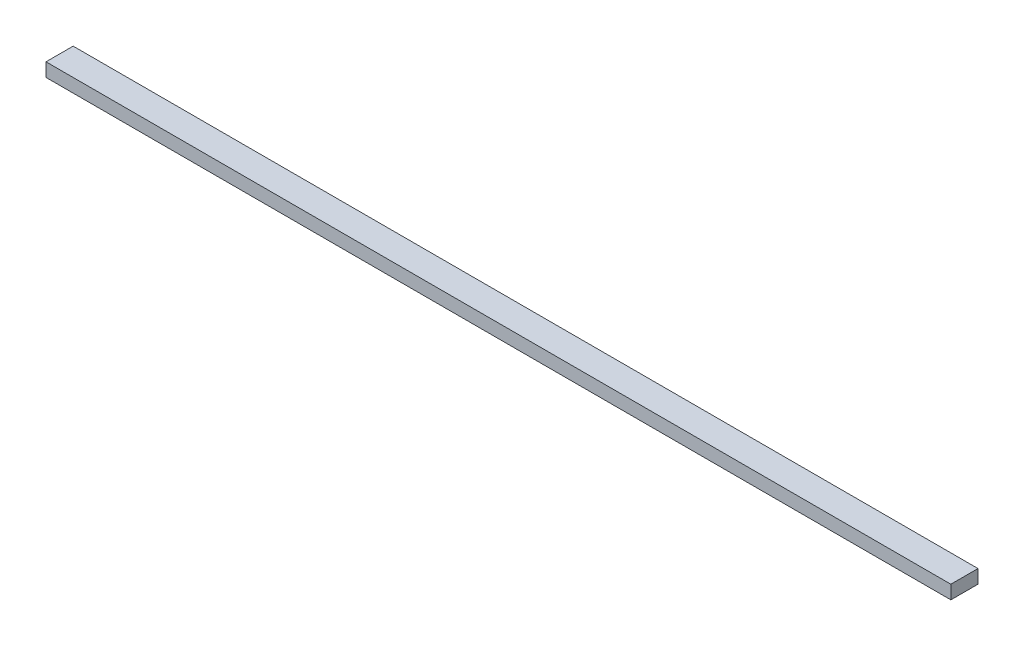
ISO-10303-21;
HEADER;
FILE_DESCRIPTION(('STEP AP214'),'2;1');
FILE_NAME('part.step','',(''),(''),'','','');
FILE_SCHEMA(('AUTOMOTIVE_DESIGN { 1 0 10303 214 1 1 1 1 }'));
ENDSEC;
DATA;
#1=APPLICATION_CONTEXT('core data for automotive mechanical design processes');
#2=APPLICATION_PROTOCOL_DEFINITION('international standard','automotive_design',2000,#1);
#3=PRODUCT_CONTEXT('',#1,'mechanical');
#4=PRODUCT('Part','Part','',(#3));
#5=PRODUCT_RELATED_PRODUCT_CATEGORY('part','',(#4));
#6=PRODUCT_DEFINITION_FORMATION('','',#4);
#7=PRODUCT_DEFINITION_CONTEXT('part definition',#1,'design');
#8=PRODUCT_DEFINITION('design','',#6,#7);
#9=PRODUCT_DEFINITION_SHAPE('','',#8);
#10=(LENGTH_UNIT() NAMED_UNIT(*) SI_UNIT(.MILLI.,.METRE.));
#11=(NAMED_UNIT(*) PLANE_ANGLE_UNIT() SI_UNIT($,.RADIAN.));
#12=(NAMED_UNIT(*) SI_UNIT($,.STERADIAN.) SOLID_ANGLE_UNIT());
#13=UNCERTAINTY_MEASURE_WITH_UNIT(LENGTH_MEASURE(1.E-05),#10,'distance_accuracy_value','');
#14=(GEOMETRIC_REPRESENTATION_CONTEXT(3) GLOBAL_UNCERTAINTY_ASSIGNED_CONTEXT((#13)) GLOBAL_UNIT_ASSIGNED_CONTEXT((#10,
#11,#12)) REPRESENTATION_CONTEXT('',''));
#15=CARTESIAN_POINT('',(0.,0.,0.));
#16=DIRECTION('',(0.,0.,1.));
#17=DIRECTION('',(1.,0.,0.));
#18=AXIS2_PLACEMENT_3D('',#15,#16,#17);
#19=CARTESIAN_POINT('',(100.,3.,3.));
#20=DIRECTION('',(-1.,0.,0.));
#21=DIRECTION('',(0.,0.,1.));
#22=AXIS2_PLACEMENT_3D('',#19,#20,#21);
#23=PLANE('',#22);
#24=DIRECTION('',(0.,0.,-1.));
#25=VECTOR('',#24,1.);
#26=CARTESIAN_POINT('',(100.,0.,3.));
#27=LINE('',#26,#25);
#28=CARTESIAN_POINT('',(100.,0.,3.));
#29=VERTEX_POINT('',#28);
#30=CARTESIAN_POINT('',(100.,0.,-3.));
#31=VERTEX_POINT('',#30);
#32=EDGE_CURVE('E98',#29,#31,#27,.T.);
#33=ORIENTED_EDGE('',*,*,#32,.T.);
#34=DIRECTION('',(0.,-1.,0.));
#35=VECTOR('',#34,1.);
#36=CARTESIAN_POINT('',(100.,3.,-3.));
#37=LINE('',#36,#35);
#38=CARTESIAN_POINT('',(100.,3.,-3.));
#39=VERTEX_POINT('',#38);
#40=EDGE_CURVE('E11',#39,#31,#37,.T.);
#41=ORIENTED_EDGE('',*,*,#40,.F.);
#42=DIRECTION('',(0.,0.,-1.));
#43=VECTOR('',#42,1.);
#44=CARTESIAN_POINT('',(100.,3.,3.));
#45=LINE('',#44,#43);
#46=CARTESIAN_POINT('',(100.,3.,3.));
#47=VERTEX_POINT('',#46);
#48=EDGE_CURVE('E86',#47,#39,#45,.T.);
#49=ORIENTED_EDGE('',*,*,#48,.F.);
#50=DIRECTION('',(0.,-1.,0.));
#51=VECTOR('',#50,1.);
#52=CARTESIAN_POINT('',(100.,3.,3.));
#53=LINE('',#52,#51);
#54=EDGE_CURVE('E94',#47,#29,#53,.T.);
#55=ORIENTED_EDGE('',*,*,#54,.T.);
#56=EDGE_LOOP('',(#33,#41,#49,#55));
#57=FACE_BOUND('',#56,.T.);
#58=ADVANCED_FACE('F35',(#57),#23,.F.);
#59=CARTESIAN_POINT('',(-100.,3.,-3.));
#60=DIRECTION('',(0.,0.,1.));
#61=DIRECTION('',(1.,0.,0.));
#62=AXIS2_PLACEMENT_3D('',#59,#60,#61);
#63=PLANE('',#62);
#64=DIRECTION('',(-1.,0.,0.));
#65=VECTOR('',#64,1.);
#66=CARTESIAN_POINT('',(-100.,0.,-3.));
#67=LINE('',#66,#65);
#68=CARTESIAN_POINT('',(-100.,0.,-3.));
#69=VERTEX_POINT('',#68);
#70=EDGE_CURVE('E90',#31,#69,#67,.T.);
#71=ORIENTED_EDGE('',*,*,#70,.T.);
#72=DIRECTION('',(0.,-1.,0.));
#73=VECTOR('',#72,1.);
#74=CARTESIAN_POINT('',(-100.,3.,-3.));
#75=LINE('',#74,#73);
#76=CARTESIAN_POINT('',(-100.,3.,-3.));
#77=VERTEX_POINT('',#76);
#78=EDGE_CURVE('E43',#77,#69,#75,.T.);
#79=ORIENTED_EDGE('',*,*,#78,.F.);
#80=DIRECTION('',(-1.,0.,0.));
#81=VECTOR('',#80,1.);
#82=CARTESIAN_POINT('',(-100.,3.,-3.));
#83=LINE('',#82,#81);
#84=EDGE_CURVE('E81',#39,#77,#83,.T.);
#85=ORIENTED_EDGE('',*,*,#84,.F.);
#86=ORIENTED_EDGE('',*,*,#40,.T.);
#87=EDGE_LOOP('',(#71,#79,#85,#86));
#88=FACE_BOUND('',#87,.T.);
#89=ADVANCED_FACE('F89',(#88),#63,.F.);
#90=CARTESIAN_POINT('',(-100.,3.,3.));
#91=DIRECTION('',(1.,0.,0.));
#92=DIRECTION('',(0.,0.,-1.));
#93=AXIS2_PLACEMENT_3D('',#90,#91,#92);
#94=PLANE('',#93);
#95=DIRECTION('',(0.,0.,1.));
#96=VECTOR('',#95,1.);
#97=CARTESIAN_POINT('',(-100.,0.,3.));
#98=LINE('',#97,#96);
#99=CARTESIAN_POINT('',(-100.,0.,3.));
#100=VERTEX_POINT('',#99);
#101=EDGE_CURVE('E68',#69,#100,#98,.T.);
#102=ORIENTED_EDGE('',*,*,#101,.T.);
#103=DIRECTION('',(0.,-1.,0.));
#104=VECTOR('',#103,1.);
#105=CARTESIAN_POINT('',(-100.,3.,3.));
#106=LINE('',#105,#104);
#107=CARTESIAN_POINT('',(-100.,3.,3.));
#108=VERTEX_POINT('',#107);
#109=EDGE_CURVE('E91',#108,#100,#106,.T.);
#110=ORIENTED_EDGE('',*,*,#109,.F.);
#111=DIRECTION('',(0.,0.,1.));
#112=VECTOR('',#111,1.);
#113=CARTESIAN_POINT('',(-100.,3.,3.));
#114=LINE('',#113,#112);
#115=EDGE_CURVE('E84',#77,#108,#114,.T.);
#116=ORIENTED_EDGE('',*,*,#115,.F.);
#117=ORIENTED_EDGE('',*,*,#78,.T.);
#118=EDGE_LOOP('',(#102,#110,#116,#117));
#119=FACE_BOUND('',#118,.T.);
#120=ADVANCED_FACE('F92',(#119),#94,.F.);
#121=CARTESIAN_POINT('',(-100.,3.,3.));
#122=DIRECTION('',(0.,0.,-1.));
#123=DIRECTION('',(-1.,0.,0.));
#124=AXIS2_PLACEMENT_3D('',#121,#122,#123);
#125=PLANE('',#124);
#126=DIRECTION('',(1.,0.,0.));
#127=VECTOR('',#126,1.);
#128=CARTESIAN_POINT('',(-100.,0.,3.));
#129=LINE('',#128,#127);
#130=EDGE_CURVE('E74',#100,#29,#129,.T.);
#131=ORIENTED_EDGE('',*,*,#130,.T.);
#132=ORIENTED_EDGE('',*,*,#54,.F.);
#133=DIRECTION('',(1.,0.,0.));
#134=VECTOR('',#133,1.);
#135=CARTESIAN_POINT('',(-100.,3.,3.));
#136=LINE('',#135,#134);
#137=EDGE_CURVE('E51',#108,#47,#136,.T.);
#138=ORIENTED_EDGE('',*,*,#137,.F.);
#139=ORIENTED_EDGE('',*,*,#109,.T.);
#140=EDGE_LOOP('',(#131,#132,#138,#139));
#141=FACE_BOUND('',#140,.T.);
#142=ADVANCED_FACE('F105',(#141),#125,.F.);
#143=CARTESIAN_POINT('',(0.,3.,0.));
#144=DIRECTION('',(0.,-1.,0.));
#145=DIRECTION('',(0.,0.,-1.));
#146=AXIS2_PLACEMENT_3D('',#143,#144,#145);
#147=PLANE('',#146);
#148=ORIENTED_EDGE('',*,*,#48,.T.);
#149=ORIENTED_EDGE('',*,*,#84,.T.);
#150=ORIENTED_EDGE('',*,*,#115,.T.);
#151=ORIENTED_EDGE('',*,*,#137,.T.);
#152=EDGE_LOOP('',(#148,#149,#150,#151));
#153=FACE_BOUND('',#152,.T.);
#154=ADVANCED_FACE('F82',(#153),#147,.F.);
#155=CARTESIAN_POINT('',(0.,0.,0.));
#156=DIRECTION('',(0.,-1.,0.));
#157=DIRECTION('',(0.,0.,-1.));
#158=AXIS2_PLACEMENT_3D('',#155,#156,#157);
#159=PLANE('',#158);
#160=ORIENTED_EDGE('',*,*,#32,.F.);
#161=ORIENTED_EDGE('',*,*,#130,.F.);
#162=ORIENTED_EDGE('',*,*,#101,.F.);
#163=ORIENTED_EDGE('',*,*,#70,.F.);
#164=EDGE_LOOP('',(#160,#161,#162,#163));
#165=FACE_BOUND('',#164,.T.);
#166=ADVANCED_FACE('F108',(#165),#159,.T.);
#167=CLOSED_SHELL('',(#58,#89,#120,#142,#154,#166));
#168=MANIFOLD_SOLID_BREP('B2',#167);
#169=ADVANCED_BREP_SHAPE_REPRESENTATION('',(#18,#168),#14);
#170=SHAPE_DEFINITION_REPRESENTATION(#9,#169);
ENDSEC;
END-ISO-10303-21;
